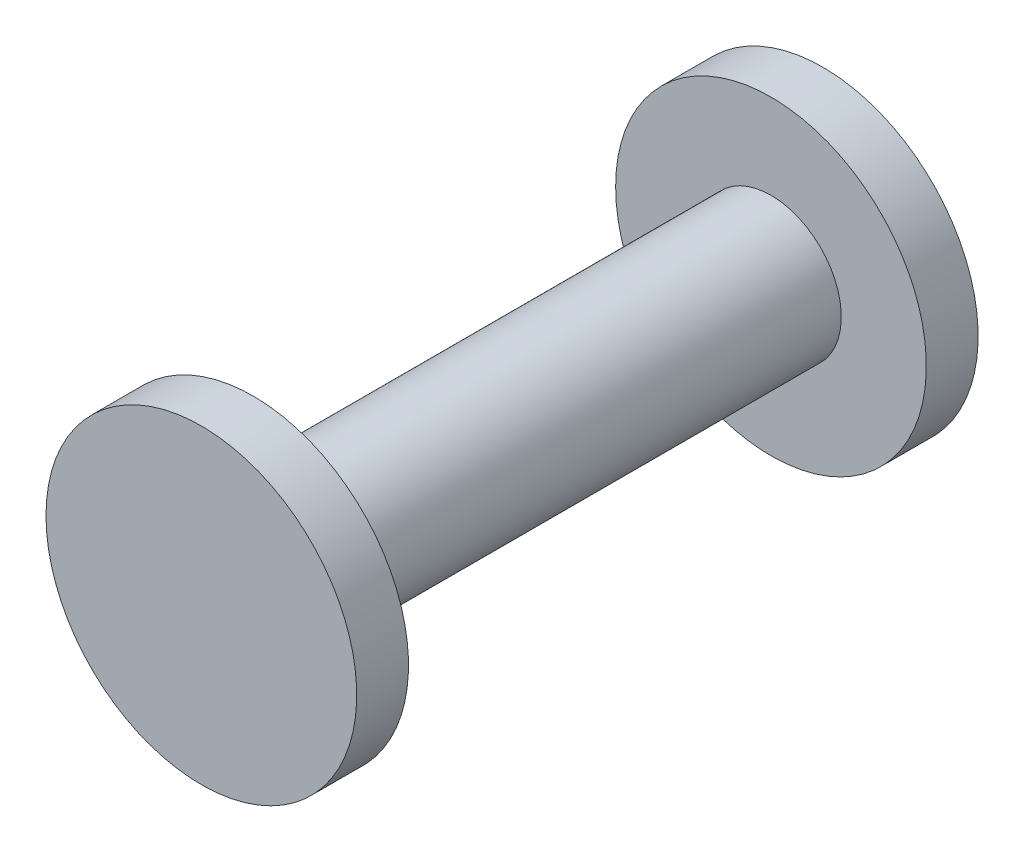
ISO-10303-21;
HEADER;
FILE_DESCRIPTION(('STEP AP214'),'2;1');
FILE_NAME('part.step','',(''),(''),'','','');
FILE_SCHEMA(('AUTOMOTIVE_DESIGN { 1 0 10303 214 1 1 1 1 }'));
ENDSEC;
DATA;
#1=APPLICATION_CONTEXT('core data for automotive mechanical design processes');
#2=APPLICATION_PROTOCOL_DEFINITION('international standard','automotive_design',2000,#1);
#3=PRODUCT_CONTEXT('',#1,'mechanical');
#4=PRODUCT('Part','Part','',(#3));
#5=PRODUCT_RELATED_PRODUCT_CATEGORY('part','',(#4));
#6=PRODUCT_DEFINITION_FORMATION('','',#4);
#7=PRODUCT_DEFINITION_CONTEXT('part definition',#1,'design');
#8=PRODUCT_DEFINITION('design','',#6,#7);
#9=PRODUCT_DEFINITION_SHAPE('','',#8);
#10=(LENGTH_UNIT() NAMED_UNIT(*) SI_UNIT(.MILLI.,.METRE.));
#11=(NAMED_UNIT(*) PLANE_ANGLE_UNIT() SI_UNIT($,.RADIAN.));
#12=(NAMED_UNIT(*) SI_UNIT($,.STERADIAN.) SOLID_ANGLE_UNIT());
#13=UNCERTAINTY_MEASURE_WITH_UNIT(LENGTH_MEASURE(1.E-05),#10,'distance_accuracy_value','');
#14=(GEOMETRIC_REPRESENTATION_CONTEXT(3) GLOBAL_UNCERTAINTY_ASSIGNED_CONTEXT((#13)) GLOBAL_UNIT_ASSIGNED_CONTEXT((#10,
#11,#12)) REPRESENTATION_CONTEXT('',''));
#15=CARTESIAN_POINT('',(0.,0.,0.));
#16=DIRECTION('',(0.,0.,1.));
#17=DIRECTION('',(1.,0.,0.));
#18=AXIS2_PLACEMENT_3D('',#15,#16,#17);
#19=CARTESIAN_POINT('',(0.,0.,-130.));
#20=DIRECTION('',(0.,0.,1.));
#21=DIRECTION('',(1.,0.,0.));
#22=AXIS2_PLACEMENT_3D('',#19,#20,#21);
#23=CYLINDRICAL_SURFACE('',#22,13.571470999608);
#24=CARTESIAN_POINT('',(0.,0.,-20.));
#25=DIRECTION('',(0.,0.,-1.));
#26=DIRECTION('',(-1.,0.,0.));
#27=AXIS2_PLACEMENT_3D('',#24,#25,#26);
#28=CIRCLE('',#27,13.571470999608);
#29=CARTESIAN_POINT('',(-13.571470999608,0.,-20.));
#30=VERTEX_POINT('',#29);
#31=EDGE_CURVE('E37',#30,#30,#28,.T.);
#32=ORIENTED_EDGE('',*,*,#31,.T.);
#33=EDGE_LOOP('',(#32));
#34=FACE_BOUND('',#33,.T.);
#35=CARTESIAN_POINT('',(0.,0.,-120.));
#36=DIRECTION('',(0.,0.,-1.));
#37=DIRECTION('',(-1.,0.,0.));
#38=AXIS2_PLACEMENT_3D('',#35,#36,#37);
#39=CIRCLE('',#38,13.571470999608);
#40=CARTESIAN_POINT('',(-13.571470999608,0.,-120.));
#41=VERTEX_POINT('',#40);
#42=EDGE_CURVE('E10',#41,#41,#39,.T.);
#43=ORIENTED_EDGE('',*,*,#42,.F.);
#44=EDGE_LOOP('',(#43));
#45=FACE_BOUND('',#44,.T.);
#46=ADVANCED_FACE('F31',(#34,#45),#23,.T.);
#47=CARTESIAN_POINT('',(0.,0.,-20.));
#48=DIRECTION('',(0.,0.,1.));
#49=DIRECTION('',(1.,0.,0.));
#50=AXIS2_PLACEMENT_3D('',#47,#48,#49);
#51=CYLINDRICAL_SURFACE('',#50,30.);
#52=CARTESIAN_POINT('',(0.,0.,-20.));
#53=DIRECTION('',(0.,0.,-1.));
#54=DIRECTION('',(-1.,0.,0.));
#55=AXIS2_PLACEMENT_3D('',#52,#53,#54);
#56=CIRCLE('',#55,30.);
#57=CARTESIAN_POINT('',(-30.,0.,-20.));
#58=VERTEX_POINT('',#57);
#59=EDGE_CURVE('E41',#58,#58,#56,.T.);
#60=ORIENTED_EDGE('',*,*,#59,.F.);
#61=EDGE_LOOP('',(#60));
#62=FACE_BOUND('',#61,.T.);
#63=CARTESIAN_POINT('',(0.,0.,-10.));
#64=DIRECTION('',(0.,0.,-1.));
#65=DIRECTION('',(-1.,0.,0.));
#66=AXIS2_PLACEMENT_3D('',#63,#64,#65);
#67=CIRCLE('',#66,30.);
#68=CARTESIAN_POINT('',(-30.,0.,-10.));
#69=VERTEX_POINT('',#68);
#70=EDGE_CURVE('E45',#69,#69,#67,.T.);
#71=ORIENTED_EDGE('',*,*,#70,.T.);
#72=EDGE_LOOP('',(#71));
#73=FACE_BOUND('',#72,.T.);
#74=ADVANCED_FACE('F72',(#62,#73),#51,.T.);
#75=CARTESIAN_POINT('',(0.,0.,-20.));
#76=DIRECTION('',(0.,0.,-1.));
#77=DIRECTION('',(-1.,0.,0.));
#78=AXIS2_PLACEMENT_3D('',#75,#76,#77);
#79=PLANE('',#78);
#80=ORIENTED_EDGE('',*,*,#31,.F.);
#81=EDGE_LOOP('',(#80));
#82=FACE_BOUND('',#81,.T.);
#83=ORIENTED_EDGE('',*,*,#59,.T.);
#84=EDGE_LOOP('',(#83));
#85=FACE_BOUND('',#84,.T.);
#86=ADVANCED_FACE('F78',(#82,#85),#79,.T.);
#87=CARTESIAN_POINT('',(0.,0.,-10.));
#88=DIRECTION('',(0.,0.,-1.));
#89=DIRECTION('',(-1.,0.,0.));
#90=AXIS2_PLACEMENT_3D('',#87,#88,#89);
#91=PLANE('',#90);
#92=ORIENTED_EDGE('',*,*,#70,.F.);
#93=EDGE_LOOP('',(#92));
#94=FACE_BOUND('',#93,.T.);
#95=ADVANCED_FACE('F69',(#94),#91,.F.);
#96=CARTESIAN_POINT('',(0.,0.,-120.));
#97=DIRECTION('',(0.,0.,-1.));
#98=DIRECTION('',(-1.,0.,0.));
#99=AXIS2_PLACEMENT_3D('',#96,#97,#98);
#100=CYLINDRICAL_SURFACE('',#99,30.);
#101=CARTESIAN_POINT('',(0.,0.,-120.));
#102=DIRECTION('',(0.,0.,-1.));
#103=DIRECTION('',(-1.,0.,0.));
#104=AXIS2_PLACEMENT_3D('',#101,#102,#103);
#105=CIRCLE('',#104,30.);
#106=CARTESIAN_POINT('',(-30.,0.,-120.));
#107=VERTEX_POINT('',#106);
#108=EDGE_CURVE('E49',#107,#107,#105,.T.);
#109=ORIENTED_EDGE('',*,*,#108,.T.);
#110=EDGE_LOOP('',(#109));
#111=FACE_BOUND('',#110,.T.);
#112=CARTESIAN_POINT('',(0.,0.,-130.));
#113=DIRECTION('',(0.,0.,-1.));
#114=DIRECTION('',(-1.,0.,0.));
#115=AXIS2_PLACEMENT_3D('',#112,#113,#114);
#116=CIRCLE('',#115,30.);
#117=CARTESIAN_POINT('',(-30.,0.,-130.));
#118=VERTEX_POINT('',#117);
#119=EDGE_CURVE('E51',#118,#118,#116,.T.);
#120=ORIENTED_EDGE('',*,*,#119,.F.);
#121=EDGE_LOOP('',(#120));
#122=FACE_BOUND('',#121,.T.);
#123=ADVANCED_FACE('F57',(#111,#122),#100,.T.);
#124=CARTESIAN_POINT('',(0.,0.,-120.));
#125=DIRECTION('',(0.,0.,-1.));
#126=DIRECTION('',(-1.,0.,0.));
#127=AXIS2_PLACEMENT_3D('',#124,#125,#126);
#128=PLANE('',#127);
#129=ORIENTED_EDGE('',*,*,#42,.T.);
#130=EDGE_LOOP('',(#129));
#131=FACE_BOUND('',#130,.T.);
#132=ORIENTED_EDGE('',*,*,#108,.F.);
#133=EDGE_LOOP('',(#132));
#134=FACE_BOUND('',#133,.T.);
#135=ADVANCED_FACE('F60',(#131,#134),#128,.F.);
#136=CARTESIAN_POINT('',(0.,0.,-130.));
#137=DIRECTION('',(0.,0.,-1.));
#138=DIRECTION('',(-1.,0.,0.));
#139=AXIS2_PLACEMENT_3D('',#136,#137,#138);
#140=PLANE('',#139);
#141=ORIENTED_EDGE('',*,*,#119,.T.);
#142=EDGE_LOOP('',(#141));
#143=FACE_BOUND('',#142,.T.);
#144=ADVANCED_FACE('F62',(#143),#140,.T.);
#145=CLOSED_SHELL('',(#46,#74,#86,#95,#123,#135,#144));
#146=MANIFOLD_SOLID_BREP('B2',#145);
#147=ADVANCED_BREP_SHAPE_REPRESENTATION('',(#18,#146),#14);
#148=SHAPE_DEFINITION_REPRESENTATION(#9,#147);
ENDSEC;
END-ISO-10303-21;
